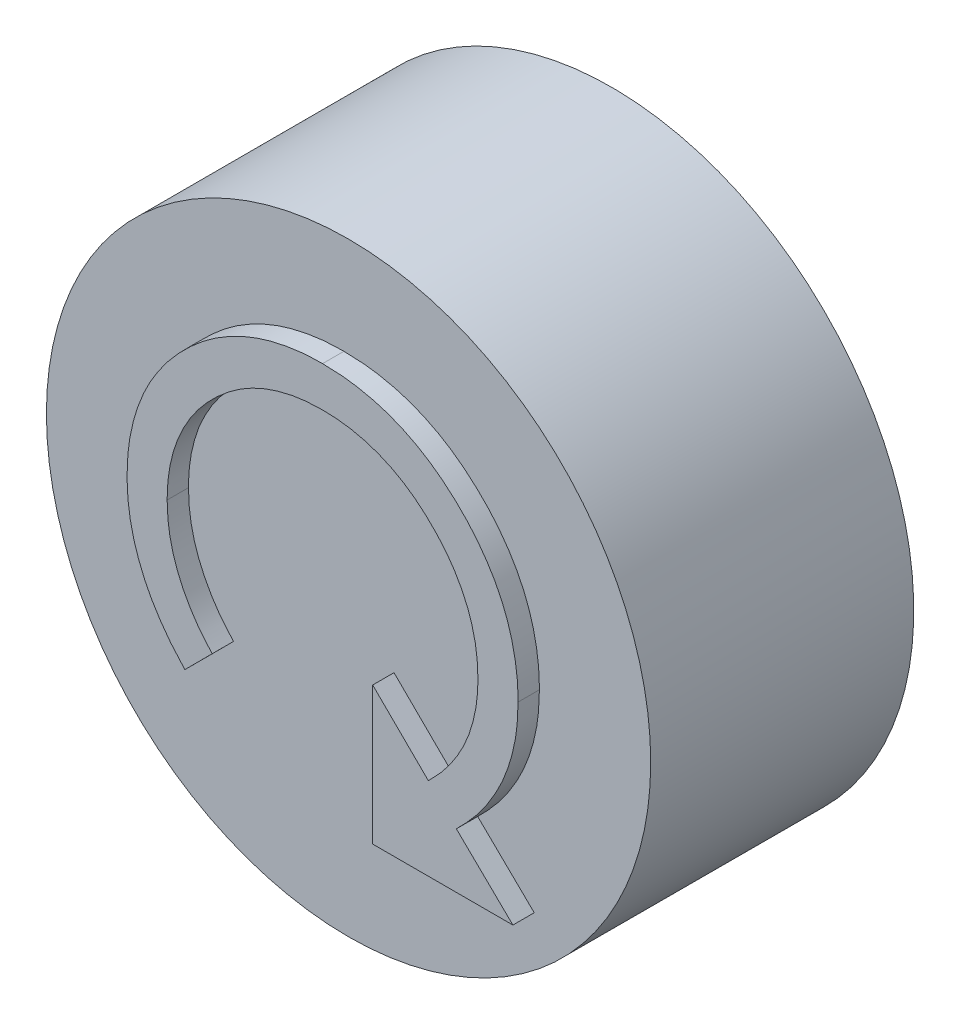
ISO-10303-21;
HEADER;
FILE_DESCRIPTION(('STEP AP214'),'2;1');
FILE_NAME('part.step','',(''),(''),'','','');
FILE_SCHEMA(('AUTOMOTIVE_DESIGN { 1 0 10303 214 1 1 1 1 }'));
ENDSEC;
DATA;
#1=APPLICATION_CONTEXT('core data for automotive mechanical design processes');
#2=APPLICATION_PROTOCOL_DEFINITION('international standard','automotive_design',2000,#1);
#3=PRODUCT_CONTEXT('',#1,'mechanical');
#4=PRODUCT('Part','Part','',(#3));
#5=PRODUCT_RELATED_PRODUCT_CATEGORY('part','',(#4));
#6=PRODUCT_DEFINITION_FORMATION('','',#4);
#7=PRODUCT_DEFINITION_CONTEXT('part definition',#1,'design');
#8=PRODUCT_DEFINITION('design','',#6,#7);
#9=PRODUCT_DEFINITION_SHAPE('','',#8);
#10=(LENGTH_UNIT() NAMED_UNIT(*) SI_UNIT(.MILLI.,.METRE.));
#11=(NAMED_UNIT(*) PLANE_ANGLE_UNIT() SI_UNIT($,.RADIAN.));
#12=(NAMED_UNIT(*) SI_UNIT($,.STERADIAN.) SOLID_ANGLE_UNIT());
#13=UNCERTAINTY_MEASURE_WITH_UNIT(LENGTH_MEASURE(1.E-05),#10,'distance_accuracy_value','');
#14=(GEOMETRIC_REPRESENTATION_CONTEXT(3) GLOBAL_UNCERTAINTY_ASSIGNED_CONTEXT((#13)) GLOBAL_UNIT_ASSIGNED_CONTEXT((#10,
#11,#12)) REPRESENTATION_CONTEXT('',''));
#15=CARTESIAN_POINT('',(0.,0.,0.));
#16=DIRECTION('',(0.,0.,1.));
#17=DIRECTION('',(1.,0.,0.));
#18=AXIS2_PLACEMENT_3D('',#15,#16,#17);
#19=CARTESIAN_POINT('',(0.,0.,-3.));
#20=DIRECTION('',(0.,0.,-1.));
#21=DIRECTION('',(-1.,0.,0.));
#22=AXIS2_PLACEMENT_3D('',#19,#20,#21);
#23=PLANE('',#22);
#24=CARTESIAN_POINT('',(0.,0.,-3.));
#25=DIRECTION('',(0.,0.,-1.));
#26=DIRECTION('',(-1.,0.,0.));
#27=AXIS2_PLACEMENT_3D('',#24,#25,#26);
#28=CIRCLE('',#27,8.5);
#29=CARTESIAN_POINT('',(-8.5,0.,-3.));
#30=VERTEX_POINT('',#29);
#31=EDGE_CURVE('E198',#30,#30,#28,.T.);
#32=ORIENTED_EDGE('',*,*,#31,.T.);
#33=EDGE_LOOP('',(#32));
#34=FACE_BOUND('',#33,.T.);
#35=CARTESIAN_POINT('',(0.,0.,-3.));
#36=DIRECTION('',(0.,0.,-1.));
#37=DIRECTION('',(-1.,0.,0.));
#38=AXIS2_PLACEMENT_3D('',#35,#36,#37);
#39=CIRCLE('',#38,7.5);
#40=CARTESIAN_POINT('',(-7.5,0.,-3.));
#41=VERTEX_POINT('',#40);
#42=EDGE_CURVE('E199',#41,#41,#39,.T.);
#43=ORIENTED_EDGE('',*,*,#42,.F.);
#44=EDGE_LOOP('',(#43));
#45=FACE_BOUND('',#44,.T.);
#46=ADVANCED_FACE('F33',(#34,#45),#23,.T.);
#47=CARTESIAN_POINT('',(0.,0.,-3.));
#48=DIRECTION('',(0.,0.,1.));
#49=DIRECTION('',(1.,0.,0.));
#50=AXIS2_PLACEMENT_3D('',#47,#48,#49);
#51=CYLINDRICAL_SURFACE('',#50,7.5);
#52=ORIENTED_EDGE('',*,*,#42,.T.);
#53=EDGE_LOOP('',(#52));
#54=FACE_BOUND('',#53,.T.);
#55=CARTESIAN_POINT('',(0.,0.,0.));
#56=DIRECTION('',(0.,0.,-1.));
#57=DIRECTION('',(-1.,0.,0.));
#58=AXIS2_PLACEMENT_3D('',#55,#56,#57);
#59=CIRCLE('',#58,7.5);
#60=CARTESIAN_POINT('',(-7.5,0.,0.));
#61=VERTEX_POINT('',#60);
#62=EDGE_CURVE('E208',#61,#61,#59,.T.);
#63=ORIENTED_EDGE('',*,*,#62,.F.);
#64=EDGE_LOOP('',(#63));
#65=FACE_BOUND('',#64,.T.);
#66=ADVANCED_FACE('F174',(#54,#65),#51,.F.);
#67=CARTESIAN_POINT('',(0.,0.,4.4));
#68=DIRECTION('',(0.,0.,1.));
#69=DIRECTION('',(1.,0.,0.));
#70=AXIS2_PLACEMENT_3D('',#67,#68,#69);
#71=PLANE('',#70);
#72=CARTESIAN_POINT('',(5.3684679962818,0.203846134455326,4.4));
#73=CARTESIAN_POINT('',(5.36368028662864,0.0162482916805712,4.4));
#74=CARTESIAN_POINT('',(5.354227057848,-0.354159576585776,4.4));
#75=CARTESIAN_POINT('',(5.27020079897427,-0.899409196662368,4.4));
#76=CARTESIAN_POINT('',(5.13270207927522,-1.42482420048173,4.4));
#77=CARTESIAN_POINT('',(4.94305148355754,-1.93220913071034,4.4));
#78=CARTESIAN_POINT('',(4.69635030523736,-2.41902658346533,4.4));
#79=CARTESIAN_POINT('',(4.39605518278509,-2.88643014426742,4.4));
#80=CARTESIAN_POINT('',(4.04351978796239,-3.33692754852538,4.4));
#81=CARTESIAN_POINT('',(3.77088907841585,-3.61162891152046,4.4));
#82=CARTESIAN_POINT('',(3.63208979115359,-3.7514823911857,4.4));
#83=B_SPLINE_CURVE_WITH_KNOTS('',3,(#72,#73,#74,#75,#76,#77,#78,#79,#80,#81,#82),.UNSPECIFIED.,
.F.,.F.,(4,1,1,1,1,1,1,1,4),(0.,0.126559526196674,0.249889037176164,0.371338886541519,
0.492610517285556,0.614774664995851,0.738959148220536,0.86710123656434,1.),.UNSPECIFIED.);
#84=CARTESIAN_POINT('',(5.3684679962818,0.203846134455326,4.4));
#85=VERTEX_POINT('',#84);
#86=CARTESIAN_POINT('',(3.63208979115359,-3.7514823911857,4.4));
#87=VERTEX_POINT('',#86);
#88=EDGE_CURVE('E193',#85,#87,#83,.T.);
#89=ORIENTED_EDGE('',*,*,#88,.T.);
#90=DIRECTION('',(0.716471188104788,-0.697616683154663,0.));
#91=VECTOR('',#90,1.);
#92=CARTESIAN_POINT('',(3.63208979115359,-3.7514823911857,4.4));
#93=LINE('',#92,#91);
#94=CARTESIAN_POINT('',(5.22303530397411,-5.30056091682672,4.4));
#95=VERTEX_POINT('',#94);
#96=EDGE_CURVE('E133',#87,#95,#93,.T.);
#97=ORIENTED_EDGE('',*,*,#96,.T.);
#98=DIRECTION('',(-1.,0.,0.));
#99=VECTOR('',#98,1.);
#100=CARTESIAN_POINT('',(5.22303530397411,-5.30056091682672,4.4));
#101=LINE('',#100,#99);
#102=CARTESIAN_POINT('',(1.27872440653821,-5.30056091682672,4.4));
#103=VERTEX_POINT('',#102);
#104=EDGE_CURVE('E294',#95,#103,#101,.T.);
#105=ORIENTED_EDGE('',*,*,#104,.T.);
#106=DIRECTION('',(0.,1.,0.));
#107=VECTOR('',#106,1.);
#108=CARTESIAN_POINT('',(1.27872440653821,-5.30056091682672,4.4));
#109=LINE('',#108,#107);
#110=CARTESIAN_POINT('',(1.27872440653821,-1.42455931426262,4.4));
#111=VERTEX_POINT('',#110);
#112=EDGE_CURVE('E292',#103,#111,#109,.T.);
#113=ORIENTED_EDGE('',*,*,#112,.T.);
#114=DIRECTION('',(0.711096004441337,-0.703094924222588,0.));
#115=VECTOR('',#114,1.);
#116=CARTESIAN_POINT('',(1.27872440653821,-1.42455931426262,4.4));
#117=LINE('',#116,#115);
#118=CARTESIAN_POINT('',(2.84543113730744,-2.97363783990365,4.4));
#119=VERTEX_POINT('',#118);
#120=EDGE_CURVE('E287',#111,#119,#117,.T.);
#121=ORIENTED_EDGE('',*,*,#120,.T.);
#122=CARTESIAN_POINT('',(2.84543113730744,-2.97363783990365,4.4));
#123=CARTESIAN_POINT('',(2.95632074984425,-2.86103458413396,4.4));
#124=CARTESIAN_POINT('',(3.17440525324257,-2.63957989100468,4.4));
#125=CARTESIAN_POINT('',(3.45921324819849,-2.27843036813573,4.4));
#126=CARTESIAN_POINT('',(3.70074242961778,-1.90286848064519,4.4));
#127=CARTESIAN_POINT('',(3.89879404868792,-1.51259006632911,4.4));
#128=CARTESIAN_POINT('',(4.05164193029941,-1.10760751459139,4.4));
#129=CARTESIAN_POINT('',(4.15915120348351,-0.687847173801279,4.4));
#130=CARTESIAN_POINT('',(4.22816695247771,-0.253828699425663,4.4));
#131=CARTESIAN_POINT('',(4.23619780487267,0.0412578421062569,4.4));
#132=CARTESIAN_POINT('',(4.24026286807667,0.190624980609172,4.4));
#133=B_SPLINE_CURVE_WITH_KNOTS('',3,(#122,#123,#124,#125,#126,#127,#128,#129,#130,#131,#132),
.UNSPECIFIED.,.F.,.F.,(4,1,1,1,1,1,1,1,4),(0.,0.133195977865222,0.261954010144519,
0.387040709609563,0.509203867701972,0.630346754241475,0.751286774325939,0.874106143120235,1.),.UNSPECIFIED.);
#134=CARTESIAN_POINT('',(4.24026286807667,0.190624980609172,4.4));
#135=VERTEX_POINT('',#134);
#136=EDGE_CURVE('E280',#119,#135,#133,.T.);
#137=ORIENTED_EDGE('',*,*,#136,.T.);
#138=CARTESIAN_POINT('',(4.24026286807667,0.190624980609172,4.4));
#139=CARTESIAN_POINT('',(4.23652197056825,0.339185131061344,4.4));
#140=CARTESIAN_POINT('',(4.22915729651249,0.631654273370861,4.4));
#141=CARTESIAN_POINT('',(4.16882099000831,1.06163543160512,4.4));
#142=CARTESIAN_POINT('',(4.06610653214898,1.47456741326072,4.4));
#143=CARTESIAN_POINT('',(3.926128217207,1.87176171015078,4.4));
#144=CARTESIAN_POINT('',(3.74251062206852,2.25182242880558,4.4));
#145=CARTESIAN_POINT('',(3.52203482763954,2.61618243923456,4.4));
#146=CARTESIAN_POINT('',(3.26051113585218,2.96439260240017,4.4));
#147=CARTESIAN_POINT('',(2.95951228591791,3.28830122152966,4.4));
#148=CARTESIAN_POINT('',(2.6349912872697,3.58918675843891,4.4));
#149=CARTESIAN_POINT('',(2.28840001617999,3.85242966778486,4.4));
#150=CARTESIAN_POINT('',(1.92441804332504,4.07470461904022,4.4));
#151=CARTESIAN_POINT('',(1.54396816310466,4.25594001143282,4.4));
#152=CARTESIAN_POINT('',(1.14748403241834,4.39765049129446,4.4));
#153=CARTESIAN_POINT('',(0.735726783090235,4.49943114151929,4.4));
#154=CARTESIAN_POINT('',(0.307322659541335,4.56019914375705,4.4));
#155=CARTESIAN_POINT('',(0.0163012383717877,4.56751675186252,4.4));
#156=CARTESIAN_POINT('',(-0.131532003718201,4.57123395496815,4.4));
#157=B_SPLINE_CURVE_WITH_KNOTS('',3,(#138,#139,#140,#141,#142,#143,#144,#145,#146,#147,#148,
#149,#150,#151,#152,#153,#154,#155,#156),.UNSPECIFIED.,.F.,.F.,(4,1,1,1,1,1,1,1,1,1,1,1,1,1,1,1,
4),(0.,0.0647677354175996,0.127507706267527,0.188881184049056,0.250073845910327,
0.310819714125592,0.372620509506102,0.435530326229131,0.500365352818561,0.565200379407991,
0.628303165238183,0.689830252269059,0.750865101301676,0.811756052612576,0.873129530394106,
0.935552260132797,1.),.UNSPECIFIED.);
#158=CARTESIAN_POINT('',(-0.131532003718201,4.57123395496815,4.4));
#159=VERTEX_POINT('',#158);
#160=EDGE_CURVE('E273',#135,#159,#157,.T.);
#161=ORIENTED_EDGE('',*,*,#160,.T.);
#162=CARTESIAN_POINT('',(-0.131532003718201,4.57123395496815,4.4));
#163=CARTESIAN_POINT('',(-0.280088337351455,4.56745986468237,4.4));
#164=CARTESIAN_POINT('',(-0.573277685773462,4.56001135646525,4.4));
#165=CARTESIAN_POINT('',(-1.00473587985889,4.49982887350574,4.4));
#166=CARTESIAN_POINT('',(-1.41822121393881,4.39734140089682,4.4));
#167=CARTESIAN_POINT('',(-1.81634663475485,4.25876712785223,4.4));
#168=CARTESIAN_POINT('',(-2.19611584762051,4.07658139213779,4.4));
#169=CARTESIAN_POINT('',(-2.56022658266022,3.85551956903668,4.4));
#170=CARTESIAN_POINT('',(-2.90389112456095,3.59036304628969,4.4));
#171=CARTESIAN_POINT('',(-3.23015273251443,3.29368098881129,4.4));
#172=CARTESIAN_POINT('',(-3.52755289868631,2.96776852506148,4.4));
#173=CARTESIAN_POINT('',(-3.79008364129902,2.62141865175253,4.4));
#174=CARTESIAN_POINT('',(-4.0071521842717,2.25544167526774,4.4));
#175=CARTESIAN_POINT('',(-4.19213235469286,1.87673475504405,4.4));
#176=CARTESIAN_POINT('',(-4.32884940654648,1.47781977402506,4.4));
#177=CARTESIAN_POINT('',(-4.43203638929722,1.06387492631159,4.4));
#178=CARTESIAN_POINT('',(-4.49207444998075,0.632358671607083,4.4));
#179=CARTESIAN_POINT('',(-4.49954275458225,0.339177281724195,4.4));
#180=CARTESIAN_POINT('',(-4.50332687551307,0.190624980609172,4.4));
#181=B_SPLINE_CURVE_WITH_KNOTS('',3,(#162,#163,#164,#165,#166,#167,#168,#169,#170,#171,#172,
#173,#174,#175,#176,#177,#178,#179,#180),.UNSPECIFIED.,.F.,.F.,(4,1,1,1,1,1,1,1,1,1,1,1,1,1,1,1,
4),(0.,0.0647142177534707,0.127719356507684,0.18935285873645,0.250086492404495,
0.311070908261865,0.372547155380595,0.435343035023691,0.499908294832709,0.564473554641729,
0.627331388901265,0.688915844020727,0.749611517845971,0.81064714126355,0.872280643492316,
0.935285782246529,1.),.UNSPECIFIED.);
#182=CARTESIAN_POINT('',(-4.50332687551307,0.190624980609172,4.4));
#183=VERTEX_POINT('',#182);
#184=EDGE_CURVE('E266',#159,#183,#181,.T.);
#185=ORIENTED_EDGE('',*,*,#184,.T.);
#186=CARTESIAN_POINT('',(-4.50332687551307,0.190624980609172,4.4));
#187=CARTESIAN_POINT('',(-4.49960876726596,0.046452953887671,4.4));
#188=CARTESIAN_POINT('',(-4.4922539919045,-0.238733167513421,4.4));
#189=CARTESIAN_POINT('',(-4.43078486611398,-0.659467236129328,4.4));
#190=CARTESIAN_POINT('',(-4.33144573392318,-1.06756951258089,4.4));
#191=CARTESIAN_POINT('',(-4.19188491017071,-1.46396717635658,4.4));
#192=CARTESIAN_POINT('',(-4.01175723031288,-1.8482905045544,4.4));
#193=CARTESIAN_POINT('',(-3.79550951795439,-2.22269170784778,4.4));
#194=CARTESIAN_POINT('',(-3.5369941602373,-2.58356992515177,4.4));
#195=CARTESIAN_POINT('',(-3.33757727637849,-2.80718570966929,4.4));
#196=CARTESIAN_POINT('',(-3.23629963192333,-2.92075322451903,4.4));
#197=B_SPLINE_CURVE_WITH_KNOTS('',3,(#186,#187,#188,#189,#190,#191,#192,#193,#194,#195,#196),
.UNSPECIFIED.,.F.,.F.,(4,1,1,1,1,1,1,1,4),(0.,0.125588746218646,0.248426607020711,
0.369673201845142,0.491137555064229,0.613988756569632,0.73903478842863,0.86746387065499,1.),.UNSPECIFIED.);
#198=CARTESIAN_POINT('',(-3.23629963192333,-2.92075322451903,4.4));
#199=VERTEX_POINT('',#198);
#200=EDGE_CURVE('E262',#183,#199,#197,.T.);
#201=ORIENTED_EDGE('',*,*,#200,.T.);
#202=DIRECTION('',(-0.706094460935261,-0.708117654233069,0.));
#203=VECTOR('',#202,1.);
#204=CARTESIAN_POINT('',(-3.23629963192333,-2.92075322451903,4.4));
#205=LINE('',#204,#203);
#206=CARTESIAN_POINT('',(-4.00533008064128,-3.69198719887801,4.4));
#207=VERTEX_POINT('',#206);
#208=EDGE_CURVE('E257',#199,#207,#205,.T.);
#209=ORIENTED_EDGE('',*,*,#208,.T.);
#210=CARTESIAN_POINT('',(-4.00533008064128,-3.69198719887801,4.4));
#211=CARTESIAN_POINT('',(-4.13527147437416,-3.54966687813121,4.4));
#212=CARTESIAN_POINT('',(-4.39110920134697,-3.26945665169057,4.4));
#213=CARTESIAN_POINT('',(-4.71931146430378,-2.81522576835511,4.4));
#214=CARTESIAN_POINT('',(-5.00433223271455,-2.35106004495122,4.4));
#215=CARTESIAN_POINT('',(-5.23014375382132,-1.86794900250968,4.4));
#216=CARTESIAN_POINT('',(-5.41151925127373,-1.3715677844823,4.4));
#217=CARTESIAN_POINT('',(-5.53870863481023,-0.859768832245443,4.4));
#218=CARTESIAN_POINT('',(-5.61574165327478,-0.332482334813003,4.4));
#219=CARTESIAN_POINT('',(-5.62622624990417,0.0236331093175377,4.4));
#220=CARTESIAN_POINT('',(-5.6315320037182,0.203846134455326,4.4));
#221=B_SPLINE_CURVE_WITH_KNOTS('',3,(#210,#211,#212,#213,#214,#215,#216,#217,#218,#219,#220),
.UNSPECIFIED.,.F.,.F.,(4,1,1,1,1,1,1,1,4),(0.,0.133439778621696,0.262725592435219,
0.387633430966381,0.510348595706379,0.631581372090268,0.753295031827133,0.875154393431315,1.),.UNSPECIFIED.);
#222=CARTESIAN_POINT('',(-5.6315320037182,0.203846134455326,4.4));
#223=VERTEX_POINT('',#222);
#224=EDGE_CURVE('E250',#207,#223,#221,.T.);
#225=ORIENTED_EDGE('',*,*,#224,.T.);
#226=CARTESIAN_POINT('',(-5.6315320037182,0.203846134455326,4.4));
#227=CARTESIAN_POINT('',(-5.62745750234227,0.390708618843149,4.4));
#228=CARTESIAN_POINT('',(-5.61943255314791,0.758744313321958,4.4));
#229=CARTESIAN_POINT('',(-5.5385209823696,1.29867258154096,4.4));
#230=CARTESIAN_POINT('',(-5.41424977682667,1.81811073894458,4.4));
#231=CARTESIAN_POINT('',(-5.2358432123237,2.3157827907123,4.4));
#232=CARTESIAN_POINT('',(-5.01164939264801,2.7951498879993,4.4));
#233=CARTESIAN_POINT('',(-4.73042278005836,3.25002856084652,4.4));
#234=CARTESIAN_POINT('',(-4.40360866591592,3.68645945819501,4.4));
#235=CARTESIAN_POINT('',(-4.02855733906465,4.09433265617616,4.4));
#236=CARTESIAN_POINT('',(-3.61989455919379,4.46879314692409,4.4));
#237=CARTESIAN_POINT('',(-3.18553267718233,4.7998723741467,4.4));
#238=CARTESIAN_POINT('',(-2.7262141572347,5.07568065498567,4.4));
#239=CARTESIAN_POINT('',(-2.24864761481675,5.30453836491458,4.4));
#240=CARTESIAN_POINT('',(-1.74943414932458,5.4822824958641,4.4));
#241=CARTESIAN_POINT('',(-1.22855863980385,5.60643758507841,4.4));
#242=CARTESIAN_POINT('',(-0.68714354589276,5.68722577676196,4.4));
#243=CARTESIAN_POINT('',(-0.318389709138432,5.69533162636509,4.4));
#244=CARTESIAN_POINT('',(-0.131532003718201,5.69943908317327,4.4));
#245=B_SPLINE_CURVE_WITH_KNOTS('',3,(#226,#227,#228,#229,#230,#231,#232,#233,#234,#235,#236,
#237,#238,#239,#240,#241,#242,#243,#244),.UNSPECIFIED.,.F.,.F.,(4,1,1,1,1,1,1,1,1,1,1,1,1,1,1,1,
4),(0.,0.0647843068121789,0.127596170130456,0.188966991545426,0.249817171584603,
0.310686022641831,0.372219036785409,0.435006085130954,0.499576050802067,0.56414601647318,
0.627086450447679,0.688704879552826,0.749682974625077,0.810533154664254,0.8721515837694,
0.935215693187821,1.),.UNSPECIFIED.);
#246=CARTESIAN_POINT('',(-0.131532003718201,5.69943908317327,4.4));
#247=VERTEX_POINT('',#246);
#248=EDGE_CURVE('E53',#223,#247,#245,.T.);
#249=ORIENTED_EDGE('',*,*,#248,.T.);
#250=CARTESIAN_POINT('',(-0.131532003718201,5.69943908317327,4.4));
#251=CARTESIAN_POINT('',(0.0545955225268761,5.69534588150747,4.4));
#252=CARTESIAN_POINT('',(0.421895617432765,5.68726844454451,4.4));
#253=CARTESIAN_POINT('',(0.961779629414005,5.60617550842731,4.4));
#254=CARTESIAN_POINT('',(1.48198112797331,5.48233038055631,4.4));
#255=CARTESIAN_POINT('',(1.98112084688498,5.30443921045779,4.4));
#256=CARTESIAN_POINT('',(2.45838177670481,5.07630373461038,4.4));
#257=CARTESIAN_POINT('',(2.91621376538038,4.79921838863324,4.4));
#258=CARTESIAN_POINT('',(3.35045855171894,4.46826502178892,4.4));
#259=CARTESIAN_POINT('',(3.76099003519934,4.09435633566277,4.4));
#260=CARTESIAN_POINT('',(4.13831598816849,3.68711749537531,4.4));
#261=CARTESIAN_POINT('',(4.4652567187565,3.25004303242581,4.4));
#262=CARTESIAN_POINT('',(4.74589495801188,2.79458024620205,4.4));
#263=CARTESIAN_POINT('',(4.97331412560068,2.31638201305504,4.4));
#264=CARTESIAN_POINT('',(5.15101263596152,1.81802914140955,4.4));
#265=CARTESIAN_POINT('',(5.27550447773516,1.29869496954295,4.4));
#266=CARTESIAN_POINT('',(5.35635611551445,0.758738454988028,4.4));
#267=CARTESIAN_POINT('',(5.3643893090253,0.390706646043681,4.4));
#268=CARTESIAN_POINT('',(5.3684679962818,0.203846134455326,4.4));
#269=B_SPLINE_CURVE_WITH_KNOTS('',3,(#250,#251,#252,#253,#254,#255,#256,#257,#258,#259,#260,
#261,#262,#263,#264,#265,#266,#267,#268),.UNSPECIFIED.,.F.,.F.,(4,1,1,1,1,1,1,1,1,1,1,1,1,1,1,1,
4),(0.,0.06454619215444,0.127374080462033,0.18900823007945,0.249873934629976,0.310867586848129,
0.372283690752761,0.435240182518394,0.500014946396459,0.564773661275065,0.627576728278962,
0.689125441143165,0.750119093361318,0.810984797911845,0.872371276667728,0.935199164975321,1.),.UNSPECIFIED.);
#270=EDGE_CURVE('E48',#247,#85,#269,.T.);
#271=ORIENTED_EDGE('',*,*,#270,.T.);
#272=EDGE_LOOP('',(#89,#97,#105,#113,#121,#137,#161,#185,#201,#209,#225,#249,#271));
#273=FACE_BOUND('',#272,.T.);
#274=CARTESIAN_POINT('',(0.,0.,4.4));
#275=DIRECTION('',(0.,0.,1.));
#276=DIRECTION('',(1.,0.,0.));
#277=AXIS2_PLACEMENT_3D('',#274,#275,#276);
#278=CIRCLE('',#277,8.5);
#279=CARTESIAN_POINT('',(8.5,0.,4.4));
#280=VERTEX_POINT('',#279);
#281=EDGE_CURVE('E11',#280,#280,#278,.T.);
#282=ORIENTED_EDGE('',*,*,#281,.T.);
#283=EDGE_LOOP('',(#282));
#284=FACE_BOUND('',#283,.T.);
#285=ADVANCED_FACE('F177',(#273,#284),#71,.T.);
#286=CARTESIAN_POINT('',(0.,0.,4.4));
#287=DIRECTION('',(0.,0.,-1.));
#288=DIRECTION('',(-1.,0.,0.));
#289=AXIS2_PLACEMENT_3D('',#286,#287,#288);
#290=CYLINDRICAL_SURFACE('',#289,8.5);
#291=ORIENTED_EDGE('',*,*,#281,.F.);
#292=EDGE_LOOP('',(#291));
#293=FACE_BOUND('',#292,.T.);
#294=ORIENTED_EDGE('',*,*,#31,.F.);
#295=EDGE_LOOP('',(#294));
#296=FACE_BOUND('',#295,.T.);
#297=ADVANCED_FACE('F35',(#293,#296),#290,.T.);
#298=CARTESIAN_POINT('',(0.,0.,1.69999999999998));
#299=DIRECTION('',(0.,0.,-1.));
#300=DIRECTION('',(-1.,0.,0.));
#301=AXIS2_PLACEMENT_3D('',#298,#299,#300);
#302=CONICAL_SURFACE('',#301,5.8,0.785398163397454);
#303=ORIENTED_EDGE('',*,*,#62,.T.);
#304=EDGE_LOOP('',(#303));
#305=FACE_BOUND('',#304,.T.);
#306=CARTESIAN_POINT('',(0.,0.,1.69999999999998));
#307=DIRECTION('',(0.,0.,-1.));
#308=DIRECTION('',(-1.,0.,0.));
#309=AXIS2_PLACEMENT_3D('',#306,#307,#308);
#310=CIRCLE('',#309,5.8);
#311=CARTESIAN_POINT('',(-5.8,0.,1.69999999999998));
#312=VERTEX_POINT('',#311);
#313=EDGE_CURVE('E203',#312,#312,#310,.T.);
#314=ORIENTED_EDGE('',*,*,#313,.F.);
#315=EDGE_LOOP('',(#314));
#316=FACE_BOUND('',#315,.T.);
#317=ADVANCED_FACE('F169',(#305,#316),#302,.F.);
#318=CARTESIAN_POINT('',(0.,0.,4.));
#319=DIRECTION('',(0.,0.,-1.));
#320=DIRECTION('',(-1.,0.,0.));
#321=AXIS2_PLACEMENT_3D('',#318,#319,#320);
#322=PLANE('',#321);
#323=CARTESIAN_POINT('',(0.,0.,4.));
#324=DIRECTION('',(0.,0.,-1.));
#325=DIRECTION('',(-1.,0.,0.));
#326=AXIS2_PLACEMENT_3D('',#323,#324,#325);
#327=CIRCLE('',#326,5.8);
#328=CARTESIAN_POINT('',(-5.8,0.,4.));
#329=VERTEX_POINT('',#328);
#330=EDGE_CURVE('E41',#329,#329,#327,.T.);
#331=ORIENTED_EDGE('',*,*,#330,.T.);
#332=EDGE_LOOP('',(#331));
#333=FACE_BOUND('',#332,.T.);
#334=ADVANCED_FACE('F172',(#333),#322,.T.);
#335=CARTESIAN_POINT('',(0.,0.,4.));
#336=DIRECTION('',(0.,0.,-1.));
#337=DIRECTION('',(-1.,0.,0.));
#338=AXIS2_PLACEMENT_3D('',#335,#336,#337);
#339=CYLINDRICAL_SURFACE('',#338,5.8);
#340=ORIENTED_EDGE('',*,*,#330,.F.);
#341=EDGE_LOOP('',(#340));
#342=FACE_BOUND('',#341,.T.);
#343=ORIENTED_EDGE('',*,*,#313,.T.);
#344=EDGE_LOOP('',(#343));
#345=FACE_BOUND('',#344,.T.);
#346=ADVANCED_FACE('F167',(#342,#345),#339,.F.);
#347=CARTESIAN_POINT('',(5.3684679962818,0.203846134455326,5.));
#348=CARTESIAN_POINT('',(5.36368028662864,0.0162482916805712,5.));
#349=CARTESIAN_POINT('',(5.354227057848,-0.354159576585776,5.));
#350=CARTESIAN_POINT('',(5.27020079897427,-0.899409196662368,5.));
#351=CARTESIAN_POINT('',(5.13270207927522,-1.42482420048173,5.));
#352=CARTESIAN_POINT('',(4.94305148355754,-1.93220913071034,5.));
#353=CARTESIAN_POINT('',(4.69635030523736,-2.41902658346533,5.));
#354=CARTESIAN_POINT('',(4.39605518278509,-2.88643014426742,5.));
#355=CARTESIAN_POINT('',(4.04351978796239,-3.33692754852538,5.));
#356=CARTESIAN_POINT('',(3.77088907841585,-3.61162891152046,5.));
#357=CARTESIAN_POINT('',(3.63208979115359,-3.7514823911857,5.));
#358=B_SPLINE_CURVE_WITH_KNOTS('',3,(#347,#348,#349,#350,#351,#352,#353,#354,#355,#356,#357),
.UNSPECIFIED.,.F.,.F.,(4,1,1,1,1,1,1,1,4),(0.,0.126559526196674,0.249889037176164,
0.371338886541519,0.492610517285556,0.614774664995851,0.738959148220536,0.86710123656434,1.),.UNSPECIFIED.);
#359=DIRECTION('',(0.,0.,-1.));
#360=VECTOR('',#359,1.);
#361=SURFACE_OF_LINEAR_EXTRUSION('',#358,#360);
#362=ORIENTED_EDGE('',*,*,#88,.F.);
#363=DIRECTION('',(0.,0.,-1.));
#364=VECTOR('',#363,1.);
#365=CARTESIAN_POINT('',(5.3684679962818,0.203846134455326,5.));
#366=LINE('',#365,#364);
#367=CARTESIAN_POINT('',(5.3684679962818,0.203846134455326,5.));
#368=VERTEX_POINT('',#367);
#369=EDGE_CURVE('E152',#368,#85,#366,.T.);
#370=ORIENTED_EDGE('',*,*,#369,.F.);
#371=CARTESIAN_POINT('',(3.63208979115359,-3.7514823911857,5.));
#372=VERTEX_POINT('',#371);
#373=EDGE_CURVE('E145',#368,#372,#358,.T.);
#374=ORIENTED_EDGE('',*,*,#373,.T.);
#375=DIRECTION('',(0.,0.,-1.));
#376=VECTOR('',#375,1.);
#377=CARTESIAN_POINT('',(3.63208979115359,-3.7514823911857,5.));
#378=LINE('',#377,#376);
#379=EDGE_CURVE('E128',#372,#87,#378,.T.);
#380=ORIENTED_EDGE('',*,*,#379,.T.);
#381=EDGE_LOOP('',(#362,#370,#374,#380));
#382=FACE_BOUND('',#381,.T.);
#383=ADVANCED_FACE('F151',(#382),#361,.T.);
#384=CARTESIAN_POINT('',(-0.131532003718201,5.69943908317327,5.));
#385=CARTESIAN_POINT('',(0.0545955225268761,5.69534588150747,5.));
#386=CARTESIAN_POINT('',(0.421895617432765,5.68726844454451,5.));
#387=CARTESIAN_POINT('',(0.961779629414005,5.60617550842731,5.));
#388=CARTESIAN_POINT('',(1.48198112797331,5.48233038055631,5.));
#389=CARTESIAN_POINT('',(1.98112084688498,5.30443921045779,5.));
#390=CARTESIAN_POINT('',(2.45838177670481,5.07630373461038,5.));
#391=CARTESIAN_POINT('',(2.91621376538038,4.79921838863324,5.));
#392=CARTESIAN_POINT('',(3.35045855171894,4.46826502178892,5.));
#393=CARTESIAN_POINT('',(3.76099003519934,4.09435633566277,5.));
#394=CARTESIAN_POINT('',(4.13831598816849,3.68711749537531,5.));
#395=CARTESIAN_POINT('',(4.4652567187565,3.25004303242581,5.));
#396=CARTESIAN_POINT('',(4.74589495801188,2.79458024620205,5.));
#397=CARTESIAN_POINT('',(4.97331412560068,2.31638201305504,5.));
#398=CARTESIAN_POINT('',(5.15101263596152,1.81802914140955,5.));
#399=CARTESIAN_POINT('',(5.27550447773516,1.29869496954295,5.));
#400=CARTESIAN_POINT('',(5.35635611551445,0.758738454988028,5.));
#401=CARTESIAN_POINT('',(5.3643893090253,0.390706646043681,5.));
#402=CARTESIAN_POINT('',(5.3684679962818,0.203846134455326,5.));
#403=B_SPLINE_CURVE_WITH_KNOTS('',3,(#384,#385,#386,#387,#388,#389,#390,#391,#392,#393,#394,
#395,#396,#397,#398,#399,#400,#401,#402),.UNSPECIFIED.,.F.,.F.,(4,1,1,1,1,1,1,1,1,1,1,1,1,1,1,1,
4),(0.,0.06454619215444,0.127374080462033,0.18900823007945,0.249873934629976,0.310867586848129,
0.372283690752761,0.435240182518394,0.500014946396459,0.564773661275065,0.627576728278962,
0.689125441143165,0.750119093361318,0.810984797911845,0.872371276667728,0.935199164975321,1.),.UNSPECIFIED.);
#404=DIRECTION('',(0.,0.,-1.));
#405=VECTOR('',#404,1.);
#406=SURFACE_OF_LINEAR_EXTRUSION('',#403,#405);
#407=ORIENTED_EDGE('',*,*,#270,.F.);
#408=DIRECTION('',(0.,0.,-1.));
#409=VECTOR('',#408,1.);
#410=CARTESIAN_POINT('',(-0.131532003718201,5.69943908317327,5.));
#411=LINE('',#410,#409);
#412=CARTESIAN_POINT('',(-0.131532003718201,5.69943908317327,5.));
#413=VERTEX_POINT('',#412);
#414=EDGE_CURVE('E239',#413,#247,#411,.T.);
#415=ORIENTED_EDGE('',*,*,#414,.F.);
#416=EDGE_CURVE('E138',#413,#368,#403,.T.);
#417=ORIENTED_EDGE('',*,*,#416,.T.);
#418=ORIENTED_EDGE('',*,*,#369,.T.);
#419=EDGE_LOOP('',(#407,#415,#417,#418));
#420=FACE_BOUND('',#419,.T.);
#421=ADVANCED_FACE('F166',(#420),#406,.T.);
#422=CARTESIAN_POINT('',(-5.6315320037182,0.203846134455326,5.));
#423=CARTESIAN_POINT('',(-5.62745750234227,0.390708618843149,5.));
#424=CARTESIAN_POINT('',(-5.61943255314791,0.758744313321958,5.));
#425=CARTESIAN_POINT('',(-5.5385209823696,1.29867258154096,5.));
#426=CARTESIAN_POINT('',(-5.41424977682667,1.81811073894458,5.));
#427=CARTESIAN_POINT('',(-5.2358432123237,2.3157827907123,5.));
#428=CARTESIAN_POINT('',(-5.01164939264801,2.7951498879993,5.));
#429=CARTESIAN_POINT('',(-4.73042278005836,3.25002856084652,5.));
#430=CARTESIAN_POINT('',(-4.40360866591592,3.68645945819501,5.));
#431=CARTESIAN_POINT('',(-4.02855733906465,4.09433265617616,5.));
#432=CARTESIAN_POINT('',(-3.61989455919379,4.46879314692409,5.));
#433=CARTESIAN_POINT('',(-3.18553267718233,4.7998723741467,5.));
#434=CARTESIAN_POINT('',(-2.7262141572347,5.07568065498567,5.));
#435=CARTESIAN_POINT('',(-2.24864761481675,5.30453836491458,5.));
#436=CARTESIAN_POINT('',(-1.74943414932458,5.4822824958641,5.));
#437=CARTESIAN_POINT('',(-1.22855863980385,5.60643758507841,5.));
#438=CARTESIAN_POINT('',(-0.68714354589276,5.68722577676196,5.));
#439=CARTESIAN_POINT('',(-0.318389709138432,5.69533162636509,5.));
#440=CARTESIAN_POINT('',(-0.131532003718201,5.69943908317327,5.));
#441=B_SPLINE_CURVE_WITH_KNOTS('',3,(#422,#423,#424,#425,#426,#427,#428,#429,#430,#431,#432,
#433,#434,#435,#436,#437,#438,#439,#440),.UNSPECIFIED.,.F.,.F.,(4,1,1,1,1,1,1,1,1,1,1,1,1,1,1,1,
4),(0.,0.0647843068121789,0.127596170130456,0.188966991545426,0.249817171584603,
0.310686022641831,0.372219036785409,0.435006085130954,0.499576050802067,0.56414601647318,
0.627086450447679,0.688704879552826,0.749682974625077,0.810533154664254,0.8721515837694,
0.935215693187821,1.),.UNSPECIFIED.);
#442=DIRECTION('',(0.,0.,-1.));
#443=VECTOR('',#442,1.);
#444=SURFACE_OF_LINEAR_EXTRUSION('',#441,#443);
#445=ORIENTED_EDGE('',*,*,#248,.F.);
#446=DIRECTION('',(0.,0.,-1.));
#447=VECTOR('',#446,1.);
#448=CARTESIAN_POINT('',(-5.6315320037182,0.203846134455326,5.));
#449=LINE('',#448,#447);
#450=CARTESIAN_POINT('',(-5.6315320037182,0.203846134455326,5.));
#451=VERTEX_POINT('',#450);
#452=EDGE_CURVE('E236',#451,#223,#449,.T.);
#453=ORIENTED_EDGE('',*,*,#452,.F.);
#454=EDGE_CURVE('E307',#451,#413,#441,.T.);
#455=ORIENTED_EDGE('',*,*,#454,.T.);
#456=ORIENTED_EDGE('',*,*,#414,.T.);
#457=EDGE_LOOP('',(#445,#453,#455,#456));
#458=FACE_BOUND('',#457,.T.);
#459=ADVANCED_FACE('F319',(#458),#444,.T.);
#460=CARTESIAN_POINT('',(-4.00533008064128,-3.69198719887801,5.));
#461=CARTESIAN_POINT('',(-4.13527147437416,-3.54966687813121,5.));
#462=CARTESIAN_POINT('',(-4.39110920134697,-3.26945665169057,5.));
#463=CARTESIAN_POINT('',(-4.71931146430378,-2.81522576835511,5.));
#464=CARTESIAN_POINT('',(-5.00433223271455,-2.35106004495122,5.));
#465=CARTESIAN_POINT('',(-5.23014375382132,-1.86794900250968,5.));
#466=CARTESIAN_POINT('',(-5.41151925127373,-1.3715677844823,5.));
#467=CARTESIAN_POINT('',(-5.53870863481023,-0.859768832245443,5.));
#468=CARTESIAN_POINT('',(-5.61574165327478,-0.332482334813003,5.));
#469=CARTESIAN_POINT('',(-5.62622624990417,0.0236331093175377,5.));
#470=CARTESIAN_POINT('',(-5.6315320037182,0.203846134455326,5.));
#471=B_SPLINE_CURVE_WITH_KNOTS('',3,(#460,#461,#462,#463,#464,#465,#466,#467,#468,#469,#470),
.UNSPECIFIED.,.F.,.F.,(4,1,1,1,1,1,1,1,4),(0.,0.133439778621696,0.262725592435219,
0.387633430966381,0.510348595706379,0.631581372090268,0.753295031827133,0.875154393431315,1.),.UNSPECIFIED.);
#472=DIRECTION('',(0.,0.,-1.));
#473=VECTOR('',#472,1.);
#474=SURFACE_OF_LINEAR_EXTRUSION('',#471,#473);
#475=ORIENTED_EDGE('',*,*,#224,.F.);
#476=DIRECTION('',(0.,0.,-1.));
#477=VECTOR('',#476,1.);
#478=CARTESIAN_POINT('',(-4.00533008064128,-3.69198719887801,5.));
#479=LINE('',#478,#477);
#480=CARTESIAN_POINT('',(-4.00533008064128,-3.69198719887801,5.));
#481=VERTEX_POINT('',#480);
#482=EDGE_CURVE('E233',#481,#207,#479,.T.);
#483=ORIENTED_EDGE('',*,*,#482,.F.);
#484=EDGE_CURVE('E330',#481,#451,#471,.T.);
#485=ORIENTED_EDGE('',*,*,#484,.T.);
#486=ORIENTED_EDGE('',*,*,#452,.T.);
#487=EDGE_LOOP('',(#475,#483,#485,#486));
#488=FACE_BOUND('',#487,.T.);
#489=ADVANCED_FACE('F323',(#488),#474,.T.);
#490=CARTESIAN_POINT('',(-3.23629963192333,-2.92075322451903,5.));
#491=DIRECTION('',(0.708117654233069,-0.706094460935261,0.));
#492=DIRECTION('',(0.706094460935261,0.708117654233069,0.));
#493=AXIS2_PLACEMENT_3D('',#490,#491,#492);
#494=PLANE('',#493);
#495=ORIENTED_EDGE('',*,*,#208,.F.);
#496=DIRECTION('',(0.,0.,-1.));
#497=VECTOR('',#496,1.);
#498=CARTESIAN_POINT('',(-3.23629963192333,-2.92075322451903,5.));
#499=LINE('',#498,#497);
#500=CARTESIAN_POINT('',(-3.23629963192333,-2.92075322451903,5.));
#501=VERTEX_POINT('',#500);
#502=EDGE_CURVE('E230',#501,#199,#499,.T.);
#503=ORIENTED_EDGE('',*,*,#502,.F.);
#504=DIRECTION('',(-0.706094460935261,-0.708117654233069,0.));
#505=VECTOR('',#504,1.);
#506=CARTESIAN_POINT('',(-3.23629963192333,-2.92075322451903,5.));
#507=LINE('',#506,#505);
#508=EDGE_CURVE('E336',#501,#481,#507,.T.);
#509=ORIENTED_EDGE('',*,*,#508,.T.);
#510=ORIENTED_EDGE('',*,*,#482,.T.);
#511=EDGE_LOOP('',(#495,#503,#509,#510));
#512=FACE_BOUND('',#511,.T.);
#513=ADVANCED_FACE('F327',(#512),#494,.T.);
#514=CARTESIAN_POINT('',(-4.50332687551307,0.190624980609172,5.));
#515=CARTESIAN_POINT('',(-4.49960876726596,0.046452953887671,5.));
#516=CARTESIAN_POINT('',(-4.4922539919045,-0.238733167513421,5.));
#517=CARTESIAN_POINT('',(-4.43078486611398,-0.659467236129328,5.));
#518=CARTESIAN_POINT('',(-4.33144573392318,-1.06756951258089,5.));
#519=CARTESIAN_POINT('',(-4.19188491017071,-1.46396717635658,5.));
#520=CARTESIAN_POINT('',(-4.01175723031288,-1.8482905045544,5.));
#521=CARTESIAN_POINT('',(-3.79550951795439,-2.22269170784778,5.));
#522=CARTESIAN_POINT('',(-3.5369941602373,-2.58356992515177,5.));
#523=CARTESIAN_POINT('',(-3.33757727637849,-2.80718570966929,5.));
#524=CARTESIAN_POINT('',(-3.23629963192333,-2.92075322451903,5.));
#525=B_SPLINE_CURVE_WITH_KNOTS('',3,(#514,#515,#516,#517,#518,#519,#520,#521,#522,#523,#524),
.UNSPECIFIED.,.F.,.F.,(4,1,1,1,1,1,1,1,4),(0.,0.125588746218646,0.248426607020711,
0.369673201845142,0.491137555064229,0.613988756569632,0.73903478842863,0.86746387065499,1.),.UNSPECIFIED.);
#526=DIRECTION('',(0.,0.,-1.));
#527=VECTOR('',#526,1.);
#528=SURFACE_OF_LINEAR_EXTRUSION('',#525,#527);
#529=ORIENTED_EDGE('',*,*,#200,.F.);
#530=DIRECTION('',(0.,0.,-1.));
#531=VECTOR('',#530,1.);
#532=CARTESIAN_POINT('',(-4.50332687551307,0.190624980609172,5.));
#533=LINE('',#532,#531);
#534=CARTESIAN_POINT('',(-4.50332687551307,0.190624980609172,5.));
#535=VERTEX_POINT('',#534);
#536=EDGE_CURVE('E227',#535,#183,#533,.T.);
#537=ORIENTED_EDGE('',*,*,#536,.F.);
#538=EDGE_CURVE('E342',#535,#501,#525,.T.);
#539=ORIENTED_EDGE('',*,*,#538,.T.);
#540=ORIENTED_EDGE('',*,*,#502,.T.);
#541=EDGE_LOOP('',(#529,#537,#539,#540));
#542=FACE_BOUND('',#541,.T.);
#543=ADVANCED_FACE('F356',(#542),#528,.T.);
#544=CARTESIAN_POINT('',(-0.131532003718201,4.57123395496815,5.));
#545=CARTESIAN_POINT('',(-0.280088337351455,4.56745986468237,5.));
#546=CARTESIAN_POINT('',(-0.573277685773462,4.56001135646525,5.));
#547=CARTESIAN_POINT('',(-1.00473587985889,4.49982887350574,5.));
#548=CARTESIAN_POINT('',(-1.41822121393881,4.39734140089682,5.));
#549=CARTESIAN_POINT('',(-1.81634663475485,4.25876712785223,5.));
#550=CARTESIAN_POINT('',(-2.19611584762051,4.07658139213779,5.));
#551=CARTESIAN_POINT('',(-2.56022658266022,3.85551956903668,5.));
#552=CARTESIAN_POINT('',(-2.90389112456095,3.59036304628969,5.));
#553=CARTESIAN_POINT('',(-3.23015273251443,3.29368098881129,5.));
#554=CARTESIAN_POINT('',(-3.52755289868631,2.96776852506148,5.));
#555=CARTESIAN_POINT('',(-3.79008364129902,2.62141865175253,5.));
#556=CARTESIAN_POINT('',(-4.0071521842717,2.25544167526774,5.));
#557=CARTESIAN_POINT('',(-4.19213235469286,1.87673475504405,5.));
#558=CARTESIAN_POINT('',(-4.32884940654648,1.47781977402506,5.));
#559=CARTESIAN_POINT('',(-4.43203638929722,1.06387492631159,5.));
#560=CARTESIAN_POINT('',(-4.49207444998075,0.632358671607083,5.));
#561=CARTESIAN_POINT('',(-4.49954275458225,0.339177281724195,5.));
#562=CARTESIAN_POINT('',(-4.50332687551307,0.190624980609172,5.));
#563=B_SPLINE_CURVE_WITH_KNOTS('',3,(#544,#545,#546,#547,#548,#549,#550,#551,#552,#553,#554,
#555,#556,#557,#558,#559,#560,#561,#562),.UNSPECIFIED.,.F.,.F.,(4,1,1,1,1,1,1,1,1,1,1,1,1,1,1,1,
4),(0.,0.0647142177534707,0.127719356507684,0.18935285873645,0.250086492404495,
0.311070908261865,0.372547155380595,0.435343035023691,0.499908294832709,0.564473554641729,
0.627331388901265,0.688915844020727,0.749611517845971,0.81064714126355,0.872280643492316,
0.935285782246529,1.),.UNSPECIFIED.);
#564=DIRECTION('',(0.,0.,-1.));
#565=VECTOR('',#564,1.);
#566=SURFACE_OF_LINEAR_EXTRUSION('',#563,#565);
#567=ORIENTED_EDGE('',*,*,#184,.F.);
#568=DIRECTION('',(0.,0.,-1.));
#569=VECTOR('',#568,1.);
#570=CARTESIAN_POINT('',(-0.131532003718201,4.57123395496815,5.));
#571=LINE('',#570,#569);
#572=CARTESIAN_POINT('',(-0.131532003718201,4.57123395496815,5.));
#573=VERTEX_POINT('',#572);
#574=EDGE_CURVE('E224',#573,#159,#571,.T.);
#575=ORIENTED_EDGE('',*,*,#574,.F.);
#576=EDGE_CURVE('E348',#573,#535,#563,.T.);
#577=ORIENTED_EDGE('',*,*,#576,.T.);
#578=ORIENTED_EDGE('',*,*,#536,.T.);
#579=EDGE_LOOP('',(#567,#575,#577,#578));
#580=FACE_BOUND('',#579,.T.);
#581=ADVANCED_FACE('F359',(#580),#566,.T.);
#582=CARTESIAN_POINT('',(4.24026286807667,0.190624980609172,5.));
#583=CARTESIAN_POINT('',(4.23652197056825,0.339185131061344,5.));
#584=CARTESIAN_POINT('',(4.22915729651249,0.631654273370861,5.));
#585=CARTESIAN_POINT('',(4.16882099000831,1.06163543160512,5.));
#586=CARTESIAN_POINT('',(4.06610653214898,1.47456741326072,5.));
#587=CARTESIAN_POINT('',(3.926128217207,1.87176171015078,5.));
#588=CARTESIAN_POINT('',(3.74251062206852,2.25182242880558,5.));
#589=CARTESIAN_POINT('',(3.52203482763954,2.61618243923456,5.));
#590=CARTESIAN_POINT('',(3.26051113585218,2.96439260240017,5.));
#591=CARTESIAN_POINT('',(2.95951228591791,3.28830122152966,5.));
#592=CARTESIAN_POINT('',(2.6349912872697,3.58918675843891,5.));
#593=CARTESIAN_POINT('',(2.28840001617999,3.85242966778486,5.));
#594=CARTESIAN_POINT('',(1.92441804332504,4.07470461904022,5.));
#595=CARTESIAN_POINT('',(1.54396816310466,4.25594001143282,5.));
#596=CARTESIAN_POINT('',(1.14748403241834,4.39765049129446,5.));
#597=CARTESIAN_POINT('',(0.735726783090235,4.49943114151929,5.));
#598=CARTESIAN_POINT('',(0.307322659541335,4.56019914375705,5.));
#599=CARTESIAN_POINT('',(0.0163012383717877,4.56751675186252,5.));
#600=CARTESIAN_POINT('',(-0.131532003718201,4.57123395496815,5.));
#601=B_SPLINE_CURVE_WITH_KNOTS('',3,(#582,#583,#584,#585,#586,#587,#588,#589,#590,#591,#592,
#593,#594,#595,#596,#597,#598,#599,#600),.UNSPECIFIED.,.F.,.F.,(4,1,1,1,1,1,1,1,1,1,1,1,1,1,1,1,
4),(0.,0.0647677354175996,0.127507706267527,0.188881184049056,0.250073845910327,
0.310819714125592,0.372620509506102,0.435530326229131,0.500365352818561,0.565200379407991,
0.628303165238183,0.689830252269059,0.750865101301676,0.811756052612576,0.873129530394106,
0.935552260132797,1.),.UNSPECIFIED.);
#602=DIRECTION('',(0.,0.,-1.));
#603=VECTOR('',#602,1.);
#604=SURFACE_OF_LINEAR_EXTRUSION('',#601,#603);
#605=ORIENTED_EDGE('',*,*,#160,.F.);
#606=DIRECTION('',(0.,0.,-1.));
#607=VECTOR('',#606,1.);
#608=CARTESIAN_POINT('',(4.24026286807667,0.190624980609172,5.));
#609=LINE('',#608,#607);
#610=CARTESIAN_POINT('',(4.24026286807667,0.190624980609172,5.));
#611=VERTEX_POINT('',#610);
#612=EDGE_CURVE('E221',#611,#135,#609,.T.);
#613=ORIENTED_EDGE('',*,*,#612,.F.);
#614=EDGE_CURVE('E371',#611,#573,#601,.T.);
#615=ORIENTED_EDGE('',*,*,#614,.T.);
#616=ORIENTED_EDGE('',*,*,#574,.T.);
#617=EDGE_LOOP('',(#605,#613,#615,#616));
#618=FACE_BOUND('',#617,.T.);
#619=ADVANCED_FACE('F363',(#618),#604,.T.);
#620=CARTESIAN_POINT('',(2.84543113730744,-2.97363783990365,5.));
#621=CARTESIAN_POINT('',(2.95632074984425,-2.86103458413396,5.));
#622=CARTESIAN_POINT('',(3.17440525324257,-2.63957989100468,5.));
#623=CARTESIAN_POINT('',(3.45921324819849,-2.27843036813573,5.));
#624=CARTESIAN_POINT('',(3.70074242961778,-1.90286848064519,5.));
#625=CARTESIAN_POINT('',(3.89879404868792,-1.51259006632911,5.));
#626=CARTESIAN_POINT('',(4.05164193029941,-1.10760751459139,5.));
#627=CARTESIAN_POINT('',(4.15915120348351,-0.687847173801279,5.));
#628=CARTESIAN_POINT('',(4.22816695247771,-0.253828699425663,5.));
#629=CARTESIAN_POINT('',(4.23619780487267,0.0412578421062569,5.));
#630=CARTESIAN_POINT('',(4.24026286807667,0.190624980609172,5.));
#631=B_SPLINE_CURVE_WITH_KNOTS('',3,(#620,#621,#622,#623,#624,#625,#626,#627,#628,#629,#630),
.UNSPECIFIED.,.F.,.F.,(4,1,1,1,1,1,1,1,4),(0.,0.133195977865222,0.261954010144519,
0.387040709609563,0.509203867701972,0.630346754241475,0.751286774325939,0.874106143120235,1.),.UNSPECIFIED.);
#632=DIRECTION('',(0.,0.,-1.));
#633=VECTOR('',#632,1.);
#634=SURFACE_OF_LINEAR_EXTRUSION('',#631,#633);
#635=ORIENTED_EDGE('',*,*,#136,.F.);
#636=DIRECTION('',(0.,0.,-1.));
#637=VECTOR('',#636,1.);
#638=CARTESIAN_POINT('',(2.84543113730744,-2.97363783990365,5.));
#639=LINE('',#638,#637);
#640=CARTESIAN_POINT('',(2.84543113730744,-2.97363783990365,5.));
#641=VERTEX_POINT('',#640);
#642=EDGE_CURVE('E218',#641,#119,#639,.T.);
#643=ORIENTED_EDGE('',*,*,#642,.F.);
#644=EDGE_CURVE('E376',#641,#611,#631,.T.);
#645=ORIENTED_EDGE('',*,*,#644,.T.);
#646=ORIENTED_EDGE('',*,*,#612,.T.);
#647=EDGE_LOOP('',(#635,#643,#645,#646));
#648=FACE_BOUND('',#647,.T.);
#649=ADVANCED_FACE('F367',(#648),#634,.T.);
#650=CARTESIAN_POINT('',(1.27872440653821,-1.42455931426262,5.));
#651=DIRECTION('',(0.703094924222587,0.711096004441337,0.));
#652=DIRECTION('',(-0.711096004441337,0.703094924222587,0.));
#653=AXIS2_PLACEMENT_3D('',#650,#651,#652);
#654=PLANE('',#653);
#655=ORIENTED_EDGE('',*,*,#120,.F.);
#656=DIRECTION('',(0.,0.,-1.));
#657=VECTOR('',#656,1.);
#658=CARTESIAN_POINT('',(1.27872440653821,-1.42455931426262,5.));
#659=LINE('',#658,#657);
#660=CARTESIAN_POINT('',(1.27872440653821,-1.42455931426262,5.));
#661=VERTEX_POINT('',#660);
#662=EDGE_CURVE('E215',#661,#111,#659,.T.);
#663=ORIENTED_EDGE('',*,*,#662,.F.);
#664=DIRECTION('',(0.711096004441337,-0.703094924222588,0.));
#665=VECTOR('',#664,1.);
#666=CARTESIAN_POINT('',(1.27872440653821,-1.42455931426262,5.));
#667=LINE('',#666,#665);
#668=EDGE_CURVE('E385',#661,#641,#667,.T.);
#669=ORIENTED_EDGE('',*,*,#668,.T.);
#670=ORIENTED_EDGE('',*,*,#642,.T.);
#671=EDGE_LOOP('',(#655,#663,#669,#670));
#672=FACE_BOUND('',#671,.T.);
#673=ADVANCED_FACE('F402',(#672),#654,.T.);
#674=CARTESIAN_POINT('',(1.27872440653821,-5.30056091682672,5.));
#675=DIRECTION('',(-1.,0.,0.));
#676=DIRECTION('',(0.,0.,1.));
#677=AXIS2_PLACEMENT_3D('',#674,#675,#676);
#678=PLANE('',#677);
#679=ORIENTED_EDGE('',*,*,#112,.F.);
#680=DIRECTION('',(0.,0.,-1.));
#681=VECTOR('',#680,1.);
#682=CARTESIAN_POINT('',(1.27872440653821,-5.30056091682672,5.));
#683=LINE('',#682,#681);
#684=CARTESIAN_POINT('',(1.27872440653821,-5.30056091682672,5.));
#685=VERTEX_POINT('',#684);
#686=EDGE_CURVE('E212',#685,#103,#683,.T.);
#687=ORIENTED_EDGE('',*,*,#686,.F.);
#688=DIRECTION('',(0.,1.,0.));
#689=VECTOR('',#688,1.);
#690=CARTESIAN_POINT('',(1.27872440653821,-5.30056091682672,5.));
#691=LINE('',#690,#689);
#692=EDGE_CURVE('E391',#685,#661,#691,.T.);
#693=ORIENTED_EDGE('',*,*,#692,.T.);
#694=ORIENTED_EDGE('',*,*,#662,.T.);
#695=EDGE_LOOP('',(#679,#687,#693,#694));
#696=FACE_BOUND('',#695,.T.);
#697=ADVANCED_FACE('F399',(#696),#678,.T.);
#698=CARTESIAN_POINT('',(5.22303530397411,-5.30056091682672,5.));
#699=DIRECTION('',(0.,-1.,0.));
#700=DIRECTION('',(0.,0.,-1.));
#701=AXIS2_PLACEMENT_3D('',#698,#699,#700);
#702=PLANE('',#701);
#703=ORIENTED_EDGE('',*,*,#104,.F.);
#704=DIRECTION('',(0.,0.,-1.));
#705=VECTOR('',#704,1.);
#706=CARTESIAN_POINT('',(5.22303530397411,-5.30056091682672,5.));
#707=LINE('',#706,#705);
#708=CARTESIAN_POINT('',(5.22303530397411,-5.30056091682672,5.));
#709=VERTEX_POINT('',#708);
#710=EDGE_CURVE('E137',#709,#95,#707,.T.);
#711=ORIENTED_EDGE('',*,*,#710,.F.);
#712=DIRECTION('',(-1.,0.,0.));
#713=VECTOR('',#712,1.);
#714=CARTESIAN_POINT('',(5.22303530397411,-5.30056091682672,5.));
#715=LINE('',#714,#713);
#716=EDGE_CURVE('E149',#709,#685,#715,.T.);
#717=ORIENTED_EDGE('',*,*,#716,.T.);
#718=ORIENTED_EDGE('',*,*,#686,.T.);
#719=EDGE_LOOP('',(#703,#711,#717,#718));
#720=FACE_BOUND('',#719,.T.);
#721=ADVANCED_FACE('F395',(#720),#702,.T.);
#722=CARTESIAN_POINT('',(3.63208979115359,-3.7514823911857,5.));
#723=DIRECTION('',(0.697616683154663,0.716471188104788,0.));
#724=DIRECTION('',(-0.716471188104788,0.697616683154663,0.));
#725=AXIS2_PLACEMENT_3D('',#722,#723,#724);
#726=PLANE('',#725);
#727=ORIENTED_EDGE('',*,*,#96,.F.);
#728=ORIENTED_EDGE('',*,*,#379,.F.);
#729=DIRECTION('',(0.716471188104788,-0.697616683154663,0.));
#730=VECTOR('',#729,1.);
#731=CARTESIAN_POINT('',(3.63208979115359,-3.7514823911857,5.));
#732=LINE('',#731,#730);
#733=EDGE_CURVE('E132',#372,#709,#732,.T.);
#734=ORIENTED_EDGE('',*,*,#733,.T.);
#735=ORIENTED_EDGE('',*,*,#710,.T.);
#736=EDGE_LOOP('',(#727,#728,#734,#735));
#737=FACE_BOUND('',#736,.T.);
#738=ADVANCED_FACE('F130',(#737),#726,.T.);
#739=CARTESIAN_POINT('',(4.92107864287775,-1.9570122587163,5.));
#740=DIRECTION('',(0.,0.,1.));
#741=DIRECTION('',(1.,0.,0.));
#742=AXIS2_PLACEMENT_3D('',#739,#740,#741);
#743=PLANE('',#742);
#744=ORIENTED_EDGE('',*,*,#373,.F.);
#745=ORIENTED_EDGE('',*,*,#416,.F.);
#746=ORIENTED_EDGE('',*,*,#454,.F.);
#747=ORIENTED_EDGE('',*,*,#484,.F.);
#748=ORIENTED_EDGE('',*,*,#508,.F.);
#749=ORIENTED_EDGE('',*,*,#538,.F.);
#750=ORIENTED_EDGE('',*,*,#576,.F.);
#751=ORIENTED_EDGE('',*,*,#614,.F.);
#752=ORIENTED_EDGE('',*,*,#644,.F.);
#753=ORIENTED_EDGE('',*,*,#668,.F.);
#754=ORIENTED_EDGE('',*,*,#692,.F.);
#755=ORIENTED_EDGE('',*,*,#716,.F.);
#756=ORIENTED_EDGE('',*,*,#733,.F.);
#757=EDGE_LOOP('',(#744,#745,#746,#747,#748,#749,#750,#751,#752,#753,#754,#755,#756));
#758=FACE_BOUND('',#757,.T.);
#759=ADVANCED_FACE('F143',(#758),#743,.T.);
#760=CLOSED_SHELL('',(#46,#66,#285,#297,#317,#334,#346,#383,#421,#459,#489,#513,#543,#581,#619,
#649,#673,#697,#721,#738,#759));
#761=MANIFOLD_SOLID_BREP('B2',#760);
#762=ADVANCED_BREP_SHAPE_REPRESENTATION('',(#18,#761),#14);
#763=SHAPE_DEFINITION_REPRESENTATION(#9,#762);
ENDSEC;
END-ISO-10303-21;
